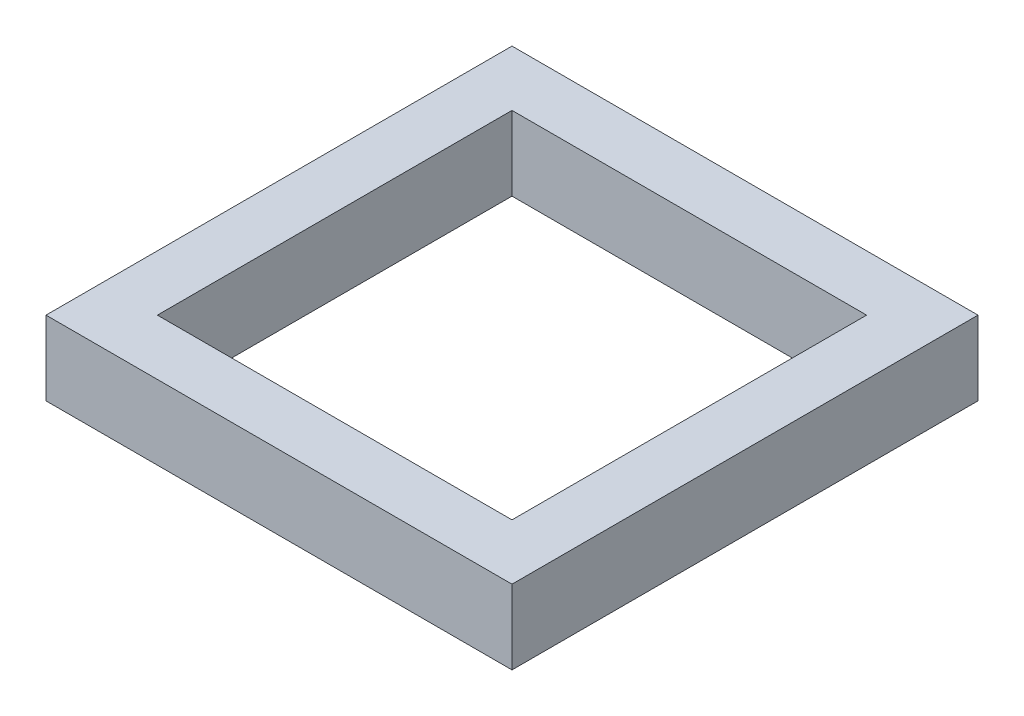
ISO-10303-21;
HEADER;
FILE_DESCRIPTION(('STEP AP214'),'2;1');
FILE_NAME('part.step','',(''),(''),'','','');
FILE_SCHEMA(('AUTOMOTIVE_DESIGN { 1 0 10303 214 1 1 1 1 }'));
ENDSEC;
DATA;
#1=APPLICATION_CONTEXT('core data for automotive mechanical design processes');
#2=APPLICATION_PROTOCOL_DEFINITION('international standard','automotive_design',2000,#1);
#3=PRODUCT_CONTEXT('',#1,'mechanical');
#4=PRODUCT('Part','Part','',(#3));
#5=PRODUCT_RELATED_PRODUCT_CATEGORY('part','',(#4));
#6=PRODUCT_DEFINITION_FORMATION('','',#4);
#7=PRODUCT_DEFINITION_CONTEXT('part definition',#1,'design');
#8=PRODUCT_DEFINITION('design','',#6,#7);
#9=PRODUCT_DEFINITION_SHAPE('','',#8);
#10=(LENGTH_UNIT() NAMED_UNIT(*) SI_UNIT(.MILLI.,.METRE.));
#11=(NAMED_UNIT(*) PLANE_ANGLE_UNIT() SI_UNIT($,.RADIAN.));
#12=(NAMED_UNIT(*) SI_UNIT($,.STERADIAN.) SOLID_ANGLE_UNIT());
#13=UNCERTAINTY_MEASURE_WITH_UNIT(LENGTH_MEASURE(1.E-05),#10,'distance_accuracy_value','');
#14=(GEOMETRIC_REPRESENTATION_CONTEXT(3) GLOBAL_UNCERTAINTY_ASSIGNED_CONTEXT((#13)) GLOBAL_UNIT_ASSIGNED_CONTEXT((#10,
#11,#12)) REPRESENTATION_CONTEXT('',''));
#15=CARTESIAN_POINT('',(0.,0.,0.));
#16=DIRECTION('',(0.,0.,1.));
#17=DIRECTION('',(1.,0.,0.));
#18=AXIS2_PLACEMENT_3D('',#15,#16,#17);
#19=CARTESIAN_POINT('',(0.,4.,0.));
#20=DIRECTION('',(0.,1.,0.));
#21=DIRECTION('',(0.,0.,1.));
#22=AXIS2_PLACEMENT_3D('',#19,#20,#21);
#23=PLANE('',#22);
#24=DIRECTION('',(0.,0.,1.));
#25=VECTOR('',#24,1.);
#26=CARTESIAN_POINT('',(-12.55,4.,12.55));
#27=LINE('',#26,#25);
#28=CARTESIAN_POINT('',(-12.55,4.,-12.55));
#29=VERTEX_POINT('',#28);
#30=CARTESIAN_POINT('',(-12.55,4.,12.55));
#31=VERTEX_POINT('',#30);
#32=EDGE_CURVE('E153',#29,#31,#27,.T.);
#33=ORIENTED_EDGE('',*,*,#32,.T.);
#34=DIRECTION('',(1.,0.,0.));
#35=VECTOR('',#34,1.);
#36=CARTESIAN_POINT('',(12.55,4.,12.55));
#37=LINE('',#36,#35);
#38=CARTESIAN_POINT('',(12.55,4.,12.55));
#39=VERTEX_POINT('',#38);
#40=EDGE_CURVE('E157',#31,#39,#37,.T.);
#41=ORIENTED_EDGE('',*,*,#40,.T.);
#42=DIRECTION('',(0.,0.,-1.));
#43=VECTOR('',#42,1.);
#44=CARTESIAN_POINT('',(12.55,4.,12.55));
#45=LINE('',#44,#43);
#46=CARTESIAN_POINT('',(12.55,4.,-12.55));
#47=VERTEX_POINT('',#46);
#48=EDGE_CURVE('E161',#39,#47,#45,.T.);
#49=ORIENTED_EDGE('',*,*,#48,.T.);
#50=DIRECTION('',(-1.,0.,0.));
#51=VECTOR('',#50,1.);
#52=CARTESIAN_POINT('',(12.55,4.,-12.55));
#53=LINE('',#52,#51);
#54=EDGE_CURVE('E164',#47,#29,#53,.T.);
#55=ORIENTED_EDGE('',*,*,#54,.T.);
#56=EDGE_LOOP('',(#33,#41,#49,#55));
#57=FACE_BOUND('',#56,.T.);
#58=DIRECTION('',(0.,0.,-1.));
#59=VECTOR('',#58,1.);
#60=CARTESIAN_POINT('',(9.55,4.,-9.55));
#61=LINE('',#60,#59);
#62=CARTESIAN_POINT('',(9.55,4.,9.55));
#63=VERTEX_POINT('',#62);
#64=CARTESIAN_POINT('',(9.55,4.,-9.55));
#65=VERTEX_POINT('',#64);
#66=EDGE_CURVE('E114',#63,#65,#61,.T.);
#67=ORIENTED_EDGE('',*,*,#66,.F.);
#68=DIRECTION('',(1.,0.,0.));
#69=VECTOR('',#68,1.);
#70=CARTESIAN_POINT('',(9.55,4.,9.55));
#71=LINE('',#70,#69);
#72=CARTESIAN_POINT('',(-9.55,4.,9.55));
#73=VERTEX_POINT('',#72);
#74=EDGE_CURVE('E105',#73,#63,#71,.T.);
#75=ORIENTED_EDGE('',*,*,#74,.F.);
#76=DIRECTION('',(0.,0.,1.));
#77=VECTOR('',#76,1.);
#78=CARTESIAN_POINT('',(-9.55,4.,9.55));
#79=LINE('',#78,#77);
#80=CARTESIAN_POINT('',(-9.55,4.,-9.55));
#81=VERTEX_POINT('',#80);
#82=EDGE_CURVE('E131',#81,#73,#79,.T.);
#83=ORIENTED_EDGE('',*,*,#82,.F.);
#84=DIRECTION('',(-1.,0.,0.));
#85=VECTOR('',#84,1.);
#86=CARTESIAN_POINT('',(9.55,4.,-9.55));
#87=LINE('',#86,#85);
#88=EDGE_CURVE('E127',#65,#81,#87,.T.);
#89=ORIENTED_EDGE('',*,*,#88,.F.);
#90=EDGE_LOOP('',(#67,#75,#83,#89));
#91=FACE_BOUND('',#90,.T.);
#92=ADVANCED_FACE('F39',(#57,#91),#23,.T.);
#93=CARTESIAN_POINT('',(0.,0.,0.));
#94=DIRECTION('',(0.,1.,0.));
#95=DIRECTION('',(0.,0.,1.));
#96=AXIS2_PLACEMENT_3D('',#93,#94,#95);
#97=PLANE('',#96);
#98=DIRECTION('',(0.,0.,1.));
#99=VECTOR('',#98,1.);
#100=CARTESIAN_POINT('',(-12.55,0.,12.55));
#101=LINE('',#100,#99);
#102=CARTESIAN_POINT('',(-12.55,0.,-12.55));
#103=VERTEX_POINT('',#102);
#104=CARTESIAN_POINT('',(-12.55,0.,12.55));
#105=VERTEX_POINT('',#104);
#106=EDGE_CURVE('E123',#103,#105,#101,.T.);
#107=ORIENTED_EDGE('',*,*,#106,.F.);
#108=DIRECTION('',(-1.,0.,0.));
#109=VECTOR('',#108,1.);
#110=CARTESIAN_POINT('',(12.55,0.,-12.55));
#111=LINE('',#110,#109);
#112=CARTESIAN_POINT('',(12.55,0.,-12.55));
#113=VERTEX_POINT('',#112);
#114=EDGE_CURVE('E158',#113,#103,#111,.T.);
#115=ORIENTED_EDGE('',*,*,#114,.F.);
#116=DIRECTION('',(0.,0.,-1.));
#117=VECTOR('',#116,1.);
#118=CARTESIAN_POINT('',(12.55,0.,12.55));
#119=LINE('',#118,#117);
#120=CARTESIAN_POINT('',(12.55,0.,12.55));
#121=VERTEX_POINT('',#120);
#122=EDGE_CURVE('E174',#121,#113,#119,.T.);
#123=ORIENTED_EDGE('',*,*,#122,.F.);
#124=DIRECTION('',(1.,0.,0.));
#125=VECTOR('',#124,1.);
#126=CARTESIAN_POINT('',(12.55,0.,12.55));
#127=LINE('',#126,#125);
#128=EDGE_CURVE('E171',#105,#121,#127,.T.);
#129=ORIENTED_EDGE('',*,*,#128,.F.);
#130=EDGE_LOOP('',(#107,#115,#123,#129));
#131=FACE_BOUND('',#130,.T.);
#132=DIRECTION('',(1.,0.,0.));
#133=VECTOR('',#132,1.);
#134=CARTESIAN_POINT('',(9.55,0.,9.55));
#135=LINE('',#134,#133);
#136=CARTESIAN_POINT('',(-9.55,0.,9.55));
#137=VERTEX_POINT('',#136);
#138=CARTESIAN_POINT('',(9.55,0.,9.55));
#139=VERTEX_POINT('',#138);
#140=EDGE_CURVE('E63',#137,#139,#135,.T.);
#141=ORIENTED_EDGE('',*,*,#140,.T.);
#142=DIRECTION('',(0.,0.,-1.));
#143=VECTOR('',#142,1.);
#144=CARTESIAN_POINT('',(9.55,0.,-9.55));
#145=LINE('',#144,#143);
#146=CARTESIAN_POINT('',(9.55,0.,-9.55));
#147=VERTEX_POINT('',#146);
#148=EDGE_CURVE('E121',#139,#147,#145,.T.);
#149=ORIENTED_EDGE('',*,*,#148,.T.);
#150=DIRECTION('',(-1.,0.,0.));
#151=VECTOR('',#150,1.);
#152=CARTESIAN_POINT('',(9.55,0.,-9.55));
#153=LINE('',#152,#151);
#154=CARTESIAN_POINT('',(-9.55,0.,-9.55));
#155=VERTEX_POINT('',#154);
#156=EDGE_CURVE('E140',#147,#155,#153,.T.);
#157=ORIENTED_EDGE('',*,*,#156,.T.);
#158=DIRECTION('',(0.,0.,1.));
#159=VECTOR('',#158,1.);
#160=CARTESIAN_POINT('',(-9.55,0.,9.55));
#161=LINE('',#160,#159);
#162=EDGE_CURVE('E115',#155,#137,#161,.T.);
#163=ORIENTED_EDGE('',*,*,#162,.T.);
#164=EDGE_LOOP('',(#141,#149,#157,#163));
#165=FACE_BOUND('',#164,.T.);
#166=ADVANCED_FACE('F197',(#131,#165),#97,.F.);
#167=CARTESIAN_POINT('',(-12.55,4.,12.55));
#168=DIRECTION('',(1.,0.,0.));
#169=DIRECTION('',(0.,0.,-1.));
#170=AXIS2_PLACEMENT_3D('',#167,#168,#169);
#171=PLANE('',#170);
#172=ORIENTED_EDGE('',*,*,#106,.T.);
#173=DIRECTION('',(0.,-1.,0.));
#174=VECTOR('',#173,1.);
#175=CARTESIAN_POINT('',(-12.55,4.,12.55));
#176=LINE('',#175,#174);
#177=EDGE_CURVE('E11',#31,#105,#176,.T.);
#178=ORIENTED_EDGE('',*,*,#177,.F.);
#179=ORIENTED_EDGE('',*,*,#32,.F.);
#180=DIRECTION('',(0.,-1.,0.));
#181=VECTOR('',#180,1.);
#182=CARTESIAN_POINT('',(-12.55,4.,-12.55));
#183=LINE('',#182,#181);
#184=EDGE_CURVE('E167',#29,#103,#183,.T.);
#185=ORIENTED_EDGE('',*,*,#184,.T.);
#186=EDGE_LOOP('',(#172,#178,#179,#185));
#187=FACE_BOUND('',#186,.T.);
#188=ADVANCED_FACE('F41',(#187),#171,.F.);
#189=CARTESIAN_POINT('',(12.55,4.,12.55));
#190=DIRECTION('',(0.,0.,-1.));
#191=DIRECTION('',(-1.,0.,0.));
#192=AXIS2_PLACEMENT_3D('',#189,#190,#191);
#193=PLANE('',#192);
#194=ORIENTED_EDGE('',*,*,#128,.T.);
#195=DIRECTION('',(0.,-1.,0.));
#196=VECTOR('',#195,1.);
#197=CARTESIAN_POINT('',(12.55,4.,12.55));
#198=LINE('',#197,#196);
#199=EDGE_CURVE('E48',#39,#121,#198,.T.);
#200=ORIENTED_EDGE('',*,*,#199,.F.);
#201=ORIENTED_EDGE('',*,*,#40,.F.);
#202=ORIENTED_EDGE('',*,*,#177,.T.);
#203=EDGE_LOOP('',(#194,#200,#201,#202));
#204=FACE_BOUND('',#203,.T.);
#205=ADVANCED_FACE('F207',(#204),#193,.F.);
#206=CARTESIAN_POINT('',(12.55,4.,12.55));
#207=DIRECTION('',(-1.,0.,0.));
#208=DIRECTION('',(0.,0.,1.));
#209=AXIS2_PLACEMENT_3D('',#206,#207,#208);
#210=PLANE('',#209);
#211=ORIENTED_EDGE('',*,*,#122,.T.);
#212=DIRECTION('',(0.,-1.,0.));
#213=VECTOR('',#212,1.);
#214=CARTESIAN_POINT('',(12.55,4.,-12.55));
#215=LINE('',#214,#213);
#216=EDGE_CURVE('E182',#47,#113,#215,.T.);
#217=ORIENTED_EDGE('',*,*,#216,.F.);
#218=ORIENTED_EDGE('',*,*,#48,.F.);
#219=ORIENTED_EDGE('',*,*,#199,.T.);
#220=EDGE_LOOP('',(#211,#217,#218,#219));
#221=FACE_BOUND('',#220,.T.);
#222=ADVANCED_FACE('F191',(#221),#210,.F.);
#223=CARTESIAN_POINT('',(12.55,4.,-12.55));
#224=DIRECTION('',(0.,0.,1.));
#225=DIRECTION('',(1.,0.,0.));
#226=AXIS2_PLACEMENT_3D('',#223,#224,#225);
#227=PLANE('',#226);
#228=ORIENTED_EDGE('',*,*,#114,.T.);
#229=ORIENTED_EDGE('',*,*,#184,.F.);
#230=ORIENTED_EDGE('',*,*,#54,.F.);
#231=ORIENTED_EDGE('',*,*,#216,.T.);
#232=EDGE_LOOP('',(#228,#229,#230,#231));
#233=FACE_BOUND('',#232,.T.);
#234=ADVANCED_FACE('F201',(#233),#227,.F.);
#235=CARTESIAN_POINT('',(9.55,4.,9.55));
#236=DIRECTION('',(0.,0.,-1.));
#237=DIRECTION('',(-1.,0.,0.));
#238=AXIS2_PLACEMENT_3D('',#235,#236,#237);
#239=PLANE('',#238);
#240=ORIENTED_EDGE('',*,*,#140,.F.);
#241=DIRECTION('',(0.,-1.,0.));
#242=VECTOR('',#241,1.);
#243=CARTESIAN_POINT('',(-9.55,4.,9.55));
#244=LINE('',#243,#242);
#245=EDGE_CURVE('E109',#73,#137,#244,.T.);
#246=ORIENTED_EDGE('',*,*,#245,.F.);
#247=ORIENTED_EDGE('',*,*,#74,.T.);
#248=DIRECTION('',(0.,-1.,0.));
#249=VECTOR('',#248,1.);
#250=CARTESIAN_POINT('',(9.55,4.,9.55));
#251=LINE('',#250,#249);
#252=EDGE_CURVE('E108',#63,#139,#251,.T.);
#253=ORIENTED_EDGE('',*,*,#252,.T.);
#254=EDGE_LOOP('',(#240,#246,#247,#253));
#255=FACE_BOUND('',#254,.T.);
#256=ADVANCED_FACE('F107',(#255),#239,.T.);
#257=CARTESIAN_POINT('',(9.55,4.,-9.55));
#258=DIRECTION('',(-1.,0.,0.));
#259=DIRECTION('',(0.,0.,1.));
#260=AXIS2_PLACEMENT_3D('',#257,#258,#259);
#261=PLANE('',#260);
#262=ORIENTED_EDGE('',*,*,#148,.F.);
#263=ORIENTED_EDGE('',*,*,#252,.F.);
#264=ORIENTED_EDGE('',*,*,#66,.T.);
#265=DIRECTION('',(0.,-1.,0.));
#266=VECTOR('',#265,1.);
#267=CARTESIAN_POINT('',(9.55,4.,-9.55));
#268=LINE('',#267,#266);
#269=EDGE_CURVE('E124',#65,#147,#268,.T.);
#270=ORIENTED_EDGE('',*,*,#269,.T.);
#271=EDGE_LOOP('',(#262,#263,#264,#270));
#272=FACE_BOUND('',#271,.T.);
#273=ADVANCED_FACE('F118',(#272),#261,.T.);
#274=CARTESIAN_POINT('',(9.55,4.,-9.55));
#275=DIRECTION('',(0.,0.,1.));
#276=DIRECTION('',(1.,0.,0.));
#277=AXIS2_PLACEMENT_3D('',#274,#275,#276);
#278=PLANE('',#277);
#279=ORIENTED_EDGE('',*,*,#156,.F.);
#280=ORIENTED_EDGE('',*,*,#269,.F.);
#281=ORIENTED_EDGE('',*,*,#88,.T.);
#282=DIRECTION('',(0.,-1.,0.));
#283=VECTOR('',#282,1.);
#284=CARTESIAN_POINT('',(-9.55,4.,-9.55));
#285=LINE('',#284,#283);
#286=EDGE_CURVE('E55',#81,#155,#285,.T.);
#287=ORIENTED_EDGE('',*,*,#286,.T.);
#288=EDGE_LOOP('',(#279,#280,#281,#287));
#289=FACE_BOUND('',#288,.T.);
#290=ADVANCED_FACE('F230',(#289),#278,.T.);
#291=CARTESIAN_POINT('',(-9.55,4.,9.55));
#292=DIRECTION('',(1.,0.,0.));
#293=DIRECTION('',(0.,0.,-1.));
#294=AXIS2_PLACEMENT_3D('',#291,#292,#293);
#295=PLANE('',#294);
#296=ORIENTED_EDGE('',*,*,#162,.F.);
#297=ORIENTED_EDGE('',*,*,#286,.F.);
#298=ORIENTED_EDGE('',*,*,#82,.T.);
#299=ORIENTED_EDGE('',*,*,#245,.T.);
#300=EDGE_LOOP('',(#296,#297,#298,#299));
#301=FACE_BOUND('',#300,.T.);
#302=ADVANCED_FACE('F234',(#301),#295,.T.);
#303=CLOSED_SHELL('',(#92,#166,#188,#205,#222,#234,#256,#273,#290,#302));
#304=MANIFOLD_SOLID_BREP('B2',#303);
#305=ADVANCED_BREP_SHAPE_REPRESENTATION('',(#18,#304),#14);
#306=SHAPE_DEFINITION_REPRESENTATION(#9,#305);
ENDSEC;
END-ISO-10303-21;
